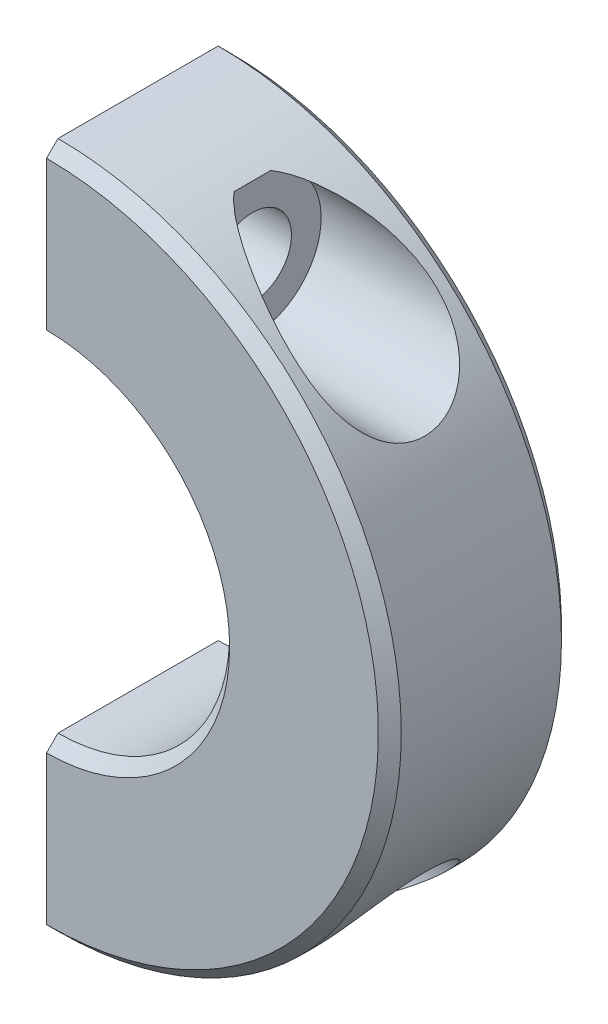
ISO-10303-21;
HEADER;
FILE_DESCRIPTION(('STEP AP214'),'2;1');
FILE_NAME('part.step','',(''),(''),'','','');
FILE_SCHEMA(('AUTOMOTIVE_DESIGN { 1 0 10303 214 1 1 1 1 }'));
ENDSEC;
DATA;
#1=APPLICATION_CONTEXT('core data for automotive mechanical design processes');
#2=APPLICATION_PROTOCOL_DEFINITION('international standard','automotive_design',2000,#1);
#3=PRODUCT_CONTEXT('',#1,'mechanical');
#4=PRODUCT('Part','Part','',(#3));
#5=PRODUCT_RELATED_PRODUCT_CATEGORY('part','',(#4));
#6=PRODUCT_DEFINITION_FORMATION('','',#4);
#7=PRODUCT_DEFINITION_CONTEXT('part definition',#1,'design');
#8=PRODUCT_DEFINITION('design','',#6,#7);
#9=PRODUCT_DEFINITION_SHAPE('','',#8);
#10=(LENGTH_UNIT() NAMED_UNIT(*) SI_UNIT(.MILLI.,.METRE.));
#11=(NAMED_UNIT(*) PLANE_ANGLE_UNIT() SI_UNIT($,.RADIAN.));
#12=(NAMED_UNIT(*) SI_UNIT($,.STERADIAN.) SOLID_ANGLE_UNIT());
#13=UNCERTAINTY_MEASURE_WITH_UNIT(LENGTH_MEASURE(1.E-05),#10,'distance_accuracy_value','');
#14=(GEOMETRIC_REPRESENTATION_CONTEXT(3) GLOBAL_UNCERTAINTY_ASSIGNED_CONTEXT((#13)) GLOBAL_UNIT_ASSIGNED_CONTEXT((#10,
#11,#12)) REPRESENTATION_CONTEXT('',''));
#15=CARTESIAN_POINT('',(0.,0.,0.));
#16=DIRECTION('',(0.,0.,1.));
#17=DIRECTION('',(1.,0.,0.));
#18=AXIS2_PLACEMENT_3D('',#15,#16,#17);
#19=CARTESIAN_POINT('',(-7.82432608787618,8.0052353615843,8.));
#20=DIRECTION('',(0.,0.,-1.));
#21=DIRECTION('',(-1.,0.,0.));
#22=AXIS2_PLACEMENT_3D('',#19,#20,#21);
#23=CYLINDRICAL_SURFACE('',#22,7.5);
#24=DIRECTION('',(0.,0.,-1.));
#25=VECTOR('',#24,1.);
#26=CARTESIAN_POINT('',(-7.82432608787618,15.5052353615843,8.));
#27=LINE('',#26,#25);
#28=CARTESIAN_POINT('',(-7.82432608787618,15.5052353615843,7.5));
#29=VERTEX_POINT('',#28);
#30=CARTESIAN_POINT('',(-7.82432608787618,15.5052353615843,0.5));
#31=VERTEX_POINT('',#30);
#32=EDGE_CURVE('E189',#29,#31,#27,.T.);
#33=ORIENTED_EDGE('',*,*,#32,.T.);
#34=CARTESIAN_POINT('',(-7.82432608787618,8.0052353615843,0.5));
#35=DIRECTION('',(0.,0.,1.));
#36=DIRECTION('',(1.,0.,0.));
#37=AXIS2_PLACEMENT_3D('',#34,#35,#36);
#38=CIRCLE('',#37,7.5);
#39=CARTESIAN_POINT('',(-7.82432608787618,0.505235361584304,0.5));
#40=VERTEX_POINT('',#39);
#41=EDGE_CURVE('E11',#31,#40,#38,.F.);
#42=ORIENTED_EDGE('',*,*,#41,.T.);
#43=DIRECTION('',(0.,0.,-1.));
#44=VECTOR('',#43,1.);
#45=CARTESIAN_POINT('',(-7.82432608787618,0.505235361584304,8.));
#46=LINE('',#45,#44);
#47=CARTESIAN_POINT('',(-7.82432608787618,0.505235361584304,7.5));
#48=VERTEX_POINT('',#47);
#49=EDGE_CURVE('E181',#48,#40,#46,.T.);
#50=ORIENTED_EDGE('',*,*,#49,.F.);
#51=CARTESIAN_POINT('',(-7.82432608787618,8.0052353615843,7.5));
#52=DIRECTION('',(0.,0.,1.));
#53=DIRECTION('',(1.,0.,0.));
#54=AXIS2_PLACEMENT_3D('',#51,#52,#53);
#55=CIRCLE('',#54,7.5);
#56=EDGE_CURVE('E48',#48,#29,#55,.T.);
#57=ORIENTED_EDGE('',*,*,#56,.T.);
#58=EDGE_LOOP('',(#33,#42,#50,#57));
#59=FACE_BOUND('',#58,.T.);
#60=ADVANCED_FACE('F39',(#59),#23,.F.);
#61=CARTESIAN_POINT('',(-7.82432608787618,0.505235361584304,8.));
#62=DIRECTION('',(1.,0.,0.));
#63=DIRECTION('',(0.,0.,-1.));
#64=AXIS2_PLACEMENT_3D('',#61,#62,#63);
#65=PLANE('',#64);
#66=CARTESIAN_POINT('',(-7.82432608787618,-3.2447646384157,4.));
#67=DIRECTION('',(-1.,0.,0.));
#68=DIRECTION('',(0.,0.,1.));
#69=AXIS2_PLACEMENT_3D('',#66,#67,#68);
#70=CIRCLE('',#69,1.7);
#71=CARTESIAN_POINT('',(-7.82432608787618,-3.2447646384157,5.7));
#72=VERTEX_POINT('',#71);
#73=EDGE_CURVE('E211',#72,#72,#70,.T.);
#74=ORIENTED_EDGE('',*,*,#73,.F.);
#75=EDGE_LOOP('',(#74));
#76=FACE_BOUND('',#75,.T.);
#77=DIRECTION('',(0.,-1.,0.));
#78=VECTOR('',#77,1.);
#79=CARTESIAN_POINT('',(-7.82432608787618,0.505235361584304,0.));
#80=LINE('',#79,#78);
#81=CARTESIAN_POINT('',(-7.82432608787618,0.00523536158430343,0.));
#82=VERTEX_POINT('',#81);
#83=CARTESIAN_POINT('',(-7.82432608787618,-6.49476463841569,0.));
#84=VERTEX_POINT('',#83);
#85=EDGE_CURVE('E197',#82,#84,#80,.T.);
#86=ORIENTED_EDGE('',*,*,#85,.T.);
#87=DIRECTION('',(0.,0.707106781186546,-0.707106781186549));
#88=VECTOR('',#87,1.);
#89=CARTESIAN_POINT('',(-7.82432608787618,8.0052353615843,-14.5));
#90=LINE('',#89,#88);
#91=CARTESIAN_POINT('',(-7.82432608787618,-6.9947646384157,0.500000000000006));
#92=VERTEX_POINT('',#91);
#93=EDGE_CURVE('E227',#84,#92,#90,.F.);
#94=ORIENTED_EDGE('',*,*,#93,.T.);
#95=DIRECTION('',(0.,0.,-1.));
#96=VECTOR('',#95,1.);
#97=CARTESIAN_POINT('',(-7.82432608787618,-6.9947646384157,8.));
#98=LINE('',#97,#96);
#99=CARTESIAN_POINT('',(-7.82432608787618,-6.9947646384157,7.5));
#100=VERTEX_POINT('',#99);
#101=EDGE_CURVE('E183',#100,#92,#98,.T.);
#102=ORIENTED_EDGE('',*,*,#101,.F.);
#103=DIRECTION('',(0.,-0.707106781186547,-0.707106781186548));
#104=VECTOR('',#103,1.);
#105=CARTESIAN_POINT('',(-7.82432608787618,8.0052353615843,22.5));
#106=LINE('',#105,#104);
#107=CARTESIAN_POINT('',(-7.82432608787618,-6.49476463841569,8.));
#108=VERTEX_POINT('',#107);
#109=EDGE_CURVE('E236',#100,#108,#106,.F.);
#110=ORIENTED_EDGE('',*,*,#109,.T.);
#111=DIRECTION('',(0.,-1.,0.));
#112=VECTOR('',#111,1.);
#113=CARTESIAN_POINT('',(-7.82432608787618,0.505235361584304,8.));
#114=LINE('',#113,#112);
#115=CARTESIAN_POINT('',(-7.82432608787618,0.0052353615843069,8.));
#116=VERTEX_POINT('',#115);
#117=EDGE_CURVE('E196',#116,#108,#114,.T.);
#118=ORIENTED_EDGE('',*,*,#117,.F.);
#119=DIRECTION('',(0.,0.707106781186548,-0.707106781186547));
#120=VECTOR('',#119,1.);
#121=CARTESIAN_POINT('',(-7.82432608787618,8.0052353615843,0.));
#122=LINE('',#121,#120);
#123=EDGE_CURVE('E62',#116,#48,#122,.T.);
#124=ORIENTED_EDGE('',*,*,#123,.T.);
#125=ORIENTED_EDGE('',*,*,#49,.T.);
#126=DIRECTION('',(0.,-0.707106781186548,-0.707106781186547));
#127=VECTOR('',#126,1.);
#128=CARTESIAN_POINT('',(-7.82432608787618,8.0052353615843,8.));
#129=LINE('',#128,#127);
#130=EDGE_CURVE('E55',#40,#82,#129,.T.);
#131=ORIENTED_EDGE('',*,*,#130,.T.);
#132=EDGE_LOOP('',(#86,#94,#102,#110,#118,#124,#125,#131));
#133=FACE_BOUND('',#132,.T.);
#134=ADVANCED_FACE('F222',(#76,#133),#65,.F.);
#135=CARTESIAN_POINT('',(-7.82432608787618,8.0052353615843,8.));
#136=DIRECTION('',(0.,0.,-1.));
#137=DIRECTION('',(-1.,0.,0.));
#138=AXIS2_PLACEMENT_3D('',#135,#136,#137);
#139=CYLINDRICAL_SURFACE('',#138,15.);
#140=DIRECTION('',(0.,0.,-1.));
#141=VECTOR('',#140,1.);
#142=CARTESIAN_POINT('',(-2.82432608787618,-6.13690026214665,8.));
#143=LINE('',#142,#141);
#144=CARTESIAN_POINT('',(-2.82432608787618,-6.13690026214665,3.20278513940947));
#145=VERTEX_POINT('',#144);
#146=CARTESIAN_POINT('',(-2.82432608787618,-6.13690026214665,4.79721486059054));
#147=VERTEX_POINT('',#146);
#148=EDGE_CURVE('E117',#145,#147,#143,.F.);
#149=ORIENTED_EDGE('',*,*,#148,.T.);
#150=CARTESIAN_POINT('',(-2.82432608787618,-6.13690026214665,4.79721486059054));
#151=CARTESIAN_POINT('',(-2.78529218232286,-6.1231043409359,4.84719100407327));
#152=CARTESIAN_POINT('',(-2.74437424641503,-6.10845163725558,4.89536280965611));
#153=CARTESIAN_POINT('',(-2.65966012991618,-6.07766974332576,4.9884732540032));
#154=CARTESIAN_POINT('',(-2.61586855247028,-6.06154289889324,5.03341683312629));
#155=CARTESIAN_POINT('',(-2.52638460330731,-6.02808565835705,5.12039100021975));
#156=CARTESIAN_POINT('',(-2.48070234615545,-6.01076140020956,5.16243451557917));
#157=CARTESIAN_POINT('',(-2.38771593453564,-5.97495613829153,5.24420517628907));
#158=CARTESIAN_POINT('',(-2.34041105483384,-5.95647461415061,5.28393126386192));
#159=CARTESIAN_POINT('',(-2.19726853041354,-5.89968084384567,5.39956546586842));
#160=CARTESIAN_POINT('',(-2.09962444749255,-5.8598044270215,5.4724735893768));
#161=CARTESIAN_POINT('',(-1.901256788298,-5.77623335003575,5.6119145546425));
#162=CARTESIAN_POINT('',(-1.80052830702002,-5.73253237833672,5.67843646319437));
#163=CARTESIAN_POINT('',(-1.60638600752188,-5.64567987262714,5.8001882015986));
#164=CARTESIAN_POINT('',(-1.51313302061116,-5.6028350635394,5.85589528077497));
#165=CARTESIAN_POINT('',(-1.32561389209858,-5.51428767744473,5.96318559449079));
#166=CARTESIAN_POINT('',(-1.23134761979383,-5.46858472801475,6.01476828960869));
#167=CARTESIAN_POINT('',(-0.947665663827515,-5.32728563995255,6.16376584906218));
#168=CARTESIAN_POINT('',(-0.757308954467999,-5.22747352997324,6.25546572982553));
#169=CARTESIAN_POINT('',(-0.375114603963123,-5.01618131661349,6.42497672140016));
#170=CARTESIAN_POINT('',(-0.183275259831398,-4.90463086711146,6.50269553690919));
#171=CARTESIAN_POINT('',(0.199145734609086,-4.67049455582736,6.64308879976207));
#172=CARTESIAN_POINT('',(0.389727715068429,-4.54791172559355,6.70576736271218));
#173=CARTESIAN_POINT('',(0.730052308691822,-4.31774665428779,6.80375215901927));
#174=CARTESIAN_POINT('',(0.880273352428712,-4.21213102040259,6.84202975985637));
#175=CARTESIAN_POINT('',(1.1783483094478,-3.99417866256421,6.90711496239047));
#176=CARTESIAN_POINT('',(1.32620215044407,-3.88184173386097,6.93392221446454));
#177=CARTESIAN_POINT('',(1.61813637188202,-3.65127897957718,6.9746239009225));
#178=CARTESIAN_POINT('',(1.76222970247759,-3.53307909226184,6.98857065087017));
#179=CARTESIAN_POINT('',(2.04622733529665,-3.29109274814703,7.00208994307614));
#180=CARTESIAN_POINT('',(2.18613330479595,-3.16730856541869,7.00166828468938));
#181=CARTESIAN_POINT('',(2.51286061888396,-2.86713176238789,6.98123889882514));
#182=CARTESIAN_POINT('',(2.6973922861843,-2.68856316787768,6.95387697750506));
#183=CARTESIAN_POINT('',(2.96369188838489,-2.41756866460869,6.8852076778196));
#184=CARTESIAN_POINT('',(3.05072661238276,-2.32669339514503,6.85770449292985));
#185=CARTESIAN_POINT('',(3.22074295342735,-2.14473674180147,6.7927181337788));
#186=CARTESIAN_POINT('',(3.30372553486217,-2.05365541241531,6.75523734796767));
#187=CARTESIAN_POINT('',(3.51010845317683,-1.8215777838475,6.64555763889731));
#188=CARTESIAN_POINT('',(3.63018700171689,-1.6811251640532,6.56566123100889));
#189=CARTESIAN_POINT('',(3.85583585768621,-1.40779706331916,6.37760406948192));
#190=CARTESIAN_POINT('',(3.9614264336424,-1.27491115218697,6.26948342922482));
#191=CARTESIAN_POINT('',(4.13827269327686,-1.04537201556519,6.04541254894212));
#192=CARTESIAN_POINT('',(4.21230806759008,-0.946427790314849,5.93405329410025));
#193=CARTESIAN_POINT('',(4.31290201542041,-0.809011287237517,5.75296156971212));
#194=CARTESIAN_POINT('',(4.34470243796092,-0.765021283960531,5.69022322885745));
#195=CARTESIAN_POINT('',(4.40460777633115,-0.681295532996571,5.56031643284508));
#196=CARTESIAN_POINT('',(4.43271426566627,-0.641557975243287,5.49314988240128));
#197=CARTESIAN_POINT('',(4.48520610229745,-0.566667930480293,5.35427614612794));
#198=CARTESIAN_POINT('',(4.5095656111965,-0.531547504008076,5.28254186919453));
#199=CARTESIAN_POINT('',(4.55414492935846,-0.466777408615062,5.13544792231699));
#200=CARTESIAN_POINT('',(4.57436670163205,-0.437125146169329,5.06008999254821));
#201=CARTESIAN_POINT('',(4.61052392694642,-0.383778162047917,4.90629746398605));
#202=CARTESIAN_POINT('',(4.62645987923576,-0.360082746489341,4.82786322476796));
#203=CARTESIAN_POINT('',(4.65391960000187,-0.319065481903753,4.66862335013541));
#204=CARTESIAN_POINT('',(4.66544388472475,-0.301742887148977,4.58781799337742));
#205=CARTESIAN_POINT('',(4.6912223504235,-0.26289676967762,4.3607582251934));
#206=CARTESIAN_POINT('',(4.70059826650653,-0.248629915868049,4.21260046455027));
#207=CARTESIAN_POINT('',(4.70478536820911,-0.242271719293024,3.91572099455359));
#208=CARTESIAN_POINT('',(4.69960200260816,-0.250172080494378,3.76699951697415));
#209=CARTESIAN_POINT('',(4.67543976864684,-0.286705765454994,3.48067603128848));
#210=CARTESIAN_POINT('',(4.65714135460061,-0.314316190092229,3.34288436983413));
#211=CARTESIAN_POINT('',(4.60793520939356,-0.387667135973238,3.07461385513785));
#212=CARTESIAN_POINT('',(4.57702752981512,-0.433407583050133,2.94413497198305));
#213=CARTESIAN_POINT('',(4.50230416595351,-0.542198795177146,2.69013723754638));
#214=CARTESIAN_POINT('',(4.45816233751061,-0.605683804939867,2.56690162531999));
#215=CARTESIAN_POINT('',(4.35832533804461,-0.746360614687451,2.3337033762947));
#216=CARTESIAN_POINT('',(4.30262701092237,-0.823556158211032,2.22374437836591));
#217=CARTESIAN_POINT('',(4.17500537803691,-0.996353957885637,2.00865490043887));
#218=CARTESIAN_POINT('',(4.10203897586505,-1.09301105382246,1.90499579591325));
#219=CARTESIAN_POINT('',(3.94529366906487,-1.29489596252987,1.71588387247778));
#220=CARTESIAN_POINT('',(3.86150850441338,-1.40012872430127,1.63044167083556));
#221=CARTESIAN_POINT('',(3.64407840148495,-1.66517455242052,1.44225222063922));
#222=CARTESIAN_POINT('',(3.50520309518682,-1.82786426964289,1.34957051712391));
#223=CARTESIAN_POINT('',(3.21219597709418,-2.15565791501109,1.19883072773373));
#224=CARTESIAN_POINT('',(3.05803227333118,-2.32076625033214,1.14084687196328));
#225=CARTESIAN_POINT('',(2.78741558908685,-2.59741453226467,1.06833717824088));
#226=CARTESIAN_POINT('',(2.67387615813358,-2.70987143184161,1.04594007144186));
#227=CARTESIAN_POINT('',(2.44225771033988,-2.93199398962835,1.01423956150819));
#228=CARTESIAN_POINT('',(2.32417698428248,-3.04165857055982,1.00494113889151));
#229=CARTESIAN_POINT('',(2.08427272626293,-3.25734546407892,0.99808461199175));
#230=CARTESIAN_POINT('',(1.96244611993309,-3.36336462495724,1.00053642167684));
#231=CARTESIAN_POINT('',(1.71585259694316,-3.57107627065355,1.01598184512354));
#232=CARTESIAN_POINT('',(1.59108571926033,-3.67276881277665,1.02897531921743));
#233=CARTESIAN_POINT('',(1.28678474795697,-3.91278532153917,1.0718298893363));
#234=CARTESIAN_POINT('',(1.10605466756808,-4.04875384103785,1.1064587636326));
#235=CARTESIAN_POINT('',(0.741259710818778,-4.3106575525724,1.19235356330686));
#236=CARTESIAN_POINT('',(0.55719320302485,-4.43658766422556,1.24362784708308));
#237=CARTESIAN_POINT('',(0.186534296898217,-4.67842447330755,1.36129662937424));
#238=CARTESIAN_POINT('',(-6.38813830519539E-05,-4.79430102262766,1.42773457442667));
#239=CARTESIAN_POINT('',(-0.373908407766652,-5.01545587497353,1.57465714413166));
#240=CARTESIAN_POINT('',(-0.561154477071237,-5.12073826229055,1.65513632260163));
#241=CARTESIAN_POINT('',(-0.872503647781923,-5.2873243434353,1.80095911894465));
#242=CARTESIAN_POINT('',(-0.996860991875705,-5.35159453118221,1.86241310287616));
#243=CARTESIAN_POINT('',(-1.2445469296085,-5.47533032566898,1.99186626096498));
#244=CARTESIAN_POINT('',(-1.36787569366211,-5.53479674306867,2.05986432651436));
#245=CARTESIAN_POINT('',(-1.61178134591978,-5.64841862165566,2.20258149250821));
#246=CARTESIAN_POINT('',(-1.73237127798184,-5.7026075897861,2.27725150408171));
#247=CARTESIAN_POINT('',(-1.97030229912616,-5.80588960647062,2.43489798110475));
#248=CARTESIAN_POINT('',(-2.08764434607982,-5.85498416947404,2.51787196348272));
#249=CARTESIAN_POINT('',(-2.25824378736318,-5.92395751192868,2.64933416376634));
#250=CARTESIAN_POINT('',(-2.31369519596254,-5.94597866410991,2.6938570120178));
#251=CARTESIAN_POINT('',(-2.42267462512185,-5.98853395206053,2.78579450864694));
#252=CARTESIAN_POINT('',(-2.47620407997067,-6.00906920883346,2.83320692622923));
#253=CARTESIAN_POINT('',(-2.5810807995866,-6.04864381133971,2.93176955341941));
#254=CARTESIAN_POINT('',(-2.63241085283076,-6.06767209791053,2.98294287851893));
#255=CARTESIAN_POINT('',(-2.73143366499599,-6.1038147358403,3.0895307006927));
#256=CARTESIAN_POINT('',(-2.77911796280977,-6.12092467555294,3.14495449931267));
#257=CARTESIAN_POINT('',(-2.8243260878762,-6.13690026214666,3.20278513940943));
#258=B_SPLINE_CURVE_WITH_KNOTS('',3,(#150,#151,#152,#153,#154,#155,#156,#157,#158,#159,#160,
#161,#162,#163,#164,#165,#166,#167,#168,#169,#170,#171,#172,#173,#174,#175,#176,#177,#178,#179,
#180,#181,#182,#183,#184,#185,#186,#187,#188,#189,#190,#191,#192,#193,#194,#195,#196,#197,#198,
#199,#200,#201,#202,#203,#204,#205,#206,#207,#208,#209,#210,#211,#212,#213,#214,#215,#216,#217,
#218,#219,#220,#221,#222,#223,#224,#225,#226,#227,#228,#229,#230,#231,#232,#233,#234,#235,#236,
#237,#238,#239,#240,#241,#242,#243,#244,#245,#246,#247,#248,#249,#250,#251,#252,#253,#254,#255,
#256,#257),.UNSPECIFIED.,.F.,.F.,(4,2,2,2,2,2,2,2,2,2,2,2,2,2,2,2,2,2,2,2,2,2,2,2,2,2,2,2,2,2,2,
2,2,2,2,2,2,2,2,2,2,2,2,2,2,2,2,2,2,2,2,2,2,4),(0.,0.194525322173448,0.388746310896801,
0.582036562383876,0.775414360752055,1.15970972918033,1.54465169808248,1.89483353878806,
2.24506110455067,2.94529899983272,3.65000219764275,4.35451234040034,4.91681645578196,
5.47913770930068,6.03916125844485,6.59895877442071,7.37067667844941,7.7567040830323,
8.14263916287527,8.74420010561327,9.34491069767869,9.84169142903171,10.0903120190087,
10.3388263583828,10.5889842043371,10.8390230946937,11.0890328457776,11.3390133321818,
11.783916437783,12.2286530615518,12.6518454694284,13.0750361461137,13.5096589857879,
13.9444006782916,14.4207845702664,14.8974453562904,15.5929520154322,16.289941321464,
16.7734335498431,17.2571095670918,17.7411937458382,18.2252715110019,18.9106813756812,
19.5964359488021,20.284180557916,20.9716590017084,21.4301084916556,21.8884804536742,
22.3437210061299,22.7988258359913,23.0220853944685,23.2451747241755,23.4697731932897,
23.6948780154941),.UNSPECIFIED.);
#259=EDGE_CURVE('E124',#147,#145,#258,.T.);
#260=ORIENTED_EDGE('',*,*,#259,.T.);
#261=EDGE_LOOP('',(#149,#260));
#262=FACE_BOUND('',#261,.T.);
#263=DIRECTION('',(0.,0.,-1.));
#264=VECTOR('',#263,1.);
#265=CARTESIAN_POINT('',(-2.82432608787618,22.1473709853153,8.));
#266=LINE('',#265,#264);
#267=CARTESIAN_POINT('',(-2.82432608787618,22.1473709853153,4.79721486059054));
#268=VERTEX_POINT('',#267);
#269=CARTESIAN_POINT('',(-2.82432608787618,22.1473709853153,3.20278513940946));
#270=VERTEX_POINT('',#269);
#271=EDGE_CURVE('E178',#268,#270,#266,.T.);
#272=ORIENTED_EDGE('',*,*,#271,.T.);
#273=CARTESIAN_POINT('',(-2.82432608787618,22.1473709853153,3.20278513940946));
#274=CARTESIAN_POINT('',(-2.78529218232286,22.1335750641045,3.15280899592672));
#275=CARTESIAN_POINT('',(-2.74437424641503,22.1189223604242,3.10463719034389));
#276=CARTESIAN_POINT('',(-2.65966012991617,22.0881404664944,3.0115267459968));
#277=CARTESIAN_POINT('',(-2.61586855247028,22.0720136220618,2.96658316687371));
#278=CARTESIAN_POINT('',(-2.5263846033073,22.0385563815257,2.87960899978025));
#279=CARTESIAN_POINT('',(-2.48070234615545,22.0212321233782,2.83756548442083));
#280=CARTESIAN_POINT('',(-2.38771593453564,21.9854268614601,2.75579482371093));
#281=CARTESIAN_POINT('',(-2.34041105483384,21.9669453373192,2.71606873613808));
#282=CARTESIAN_POINT('',(-2.19726853041354,21.9101515670143,2.60043453413158));
#283=CARTESIAN_POINT('',(-2.09962444749255,21.8702751501901,2.5275264106232));
#284=CARTESIAN_POINT('',(-1.901256788298,21.7867040732044,2.3880854453575));
#285=CARTESIAN_POINT('',(-1.80052830702002,21.7430031015053,2.32156353680563));
#286=CARTESIAN_POINT('',(-1.60638600752187,21.6561505957957,2.1998117984014));
#287=CARTESIAN_POINT('',(-1.51313302061115,21.613305786708,2.14410471922503));
#288=CARTESIAN_POINT('',(-1.32561389209858,21.5247584006133,2.03681440550921));
#289=CARTESIAN_POINT('',(-1.23134761979383,21.4790554511833,1.98523171039131));
#290=CARTESIAN_POINT('',(-0.947665663827513,21.3377563631212,1.83623415093781));
#291=CARTESIAN_POINT('',(-0.757308954467998,21.2379442531418,1.74453427017446));
#292=CARTESIAN_POINT('',(-0.37511460396312,21.0266520397821,1.57502327859984));
#293=CARTESIAN_POINT('',(-0.183275259831394,20.9151015902801,1.49730446309081));
#294=CARTESIAN_POINT('',(0.199145734609092,20.680965278996,1.35691120023794));
#295=CARTESIAN_POINT('',(0.389727715068434,20.5583824487622,1.29423263728782));
#296=CARTESIAN_POINT('',(0.730052308691827,20.3282173774564,1.19624784098073));
#297=CARTESIAN_POINT('',(0.880273352428719,20.2226017435712,1.15797024014363));
#298=CARTESIAN_POINT('',(1.1783483094478,20.0046493857328,1.09288503760953));
#299=CARTESIAN_POINT('',(1.32620215044407,19.8923124570296,1.06607778553546));
#300=CARTESIAN_POINT('',(1.61813637188202,19.6617497027458,1.0253760990775));
#301=CARTESIAN_POINT('',(1.7622297024776,19.5435498154304,1.01142934912983));
#302=CARTESIAN_POINT('',(2.04622733529666,19.3015634713156,0.997910056923862));
#303=CARTESIAN_POINT('',(2.18613330479595,19.1777792885873,0.998331715310623));
#304=CARTESIAN_POINT('',(2.51286061888396,18.8776024855565,1.01876110117486));
#305=CARTESIAN_POINT('',(2.69739228618431,18.6990338910463,1.04612302249494));
#306=CARTESIAN_POINT('',(2.96369188838489,18.4280393877773,1.1147923221804));
#307=CARTESIAN_POINT('',(3.05072661238276,18.3371641183136,1.14229550707016));
#308=CARTESIAN_POINT('',(3.22074295342735,18.1552074649701,1.20728186622121));
#309=CARTESIAN_POINT('',(3.30372553486217,18.0641261355839,1.24476265203233));
#310=CARTESIAN_POINT('',(3.51010845317684,17.8320485070161,1.3544423611027));
#311=CARTESIAN_POINT('',(3.63018700171689,17.6915958872218,1.43433876899111));
#312=CARTESIAN_POINT('',(3.85583585768621,17.4182677864878,1.62239593051808));
#313=CARTESIAN_POINT('',(3.96142643364241,17.2853818753556,1.73051657077518));
#314=CARTESIAN_POINT('',(4.13827269327686,17.0558427387338,1.95458745105789));
#315=CARTESIAN_POINT('',(4.21230806759008,16.9568985134835,2.06594670589976));
#316=CARTESIAN_POINT('',(4.31290201542041,16.8194820104061,2.24703843028788));
#317=CARTESIAN_POINT('',(4.34470243796093,16.7754920071291,2.30977677114255));
#318=CARTESIAN_POINT('',(4.40460777633115,16.6917662561652,2.43968356715493));
#319=CARTESIAN_POINT('',(4.43271426566627,16.6520286984119,2.50685011759873));
#320=CARTESIAN_POINT('',(4.48520610229745,16.5771386536489,2.64572385387206));
#321=CARTESIAN_POINT('',(4.5095656111965,16.5420182271767,2.71745813080548));
#322=CARTESIAN_POINT('',(4.55414492935846,16.4772481317837,2.86455207768301));
#323=CARTESIAN_POINT('',(4.57436670163205,16.4475958693379,2.9399100074518));
#324=CARTESIAN_POINT('',(4.61052392694642,16.3942488852165,3.09370253601395));
#325=CARTESIAN_POINT('',(4.62645987923576,16.3705534696579,3.17213677523205));
#326=CARTESIAN_POINT('',(4.65391960000188,16.3295362050724,3.33137664986459));
#327=CARTESIAN_POINT('',(4.66544388472475,16.3122136103176,3.41218200662259));
#328=CARTESIAN_POINT('',(4.6912223504235,16.2733674928462,3.63924177480661));
#329=CARTESIAN_POINT('',(4.70059826650653,16.2591006390367,3.78739953544974));
#330=CARTESIAN_POINT('',(4.70478536820911,16.2527424424616,4.08427900544642));
#331=CARTESIAN_POINT('',(4.69960200260816,16.260642803663,4.23300048302586));
#332=CARTESIAN_POINT('',(4.67543976864684,16.2971764886236,4.51932396871153));
#333=CARTESIAN_POINT('',(4.6571413546006,16.3247869132608,4.65711563016587));
#334=CARTESIAN_POINT('',(4.60793520939356,16.3981378591418,4.92538614486215));
#335=CARTESIAN_POINT('',(4.57702752981512,16.4438783062187,5.05586502801695));
#336=CARTESIAN_POINT('',(4.50230416595351,16.5526695183458,5.30986276245362));
#337=CARTESIAN_POINT('',(4.45816233751061,16.6161545281085,5.43309837468002));
#338=CARTESIAN_POINT('',(4.3583253380446,16.7568313378561,5.6662966237053));
#339=CARTESIAN_POINT('',(4.30262701092237,16.8340268813796,5.7762556216341));
#340=CARTESIAN_POINT('',(4.17500537803691,17.0068246810542,5.99134509956114));
#341=CARTESIAN_POINT('',(4.10203897586505,17.1034817769911,6.09500420408675));
#342=CARTESIAN_POINT('',(3.94529366906487,17.3053666856985,6.28411612752222));
#343=CARTESIAN_POINT('',(3.86150850441338,17.4105994474699,6.36955832916444));
#344=CARTESIAN_POINT('',(3.64407840148495,17.6756452755891,6.55774777936078));
#345=CARTESIAN_POINT('',(3.50520309518682,17.8383349928115,6.65042948287609));
#346=CARTESIAN_POINT('',(3.21219597709417,18.1661286381797,6.80116927226627));
#347=CARTESIAN_POINT('',(3.05803227333117,18.3312369735008,6.85915312803672));
#348=CARTESIAN_POINT('',(2.78741558908684,18.6078852554333,6.93166282175912));
#349=CARTESIAN_POINT('',(2.67387615813357,18.7203421550102,6.95405992855814));
#350=CARTESIAN_POINT('',(2.44225771033988,18.942464712797,6.98576043849181));
#351=CARTESIAN_POINT('',(2.32417698428248,19.0521292937284,6.99505886110849));
#352=CARTESIAN_POINT('',(2.08427272626292,19.2678161872475,7.00191538800825));
#353=CARTESIAN_POINT('',(1.96244611993308,19.3738353481258,6.99946357832316));
#354=CARTESIAN_POINT('',(1.71585259694315,19.5815469938222,6.98401815487646));
#355=CARTESIAN_POINT('',(1.59108571926032,19.6832395359453,6.97102468078257));
#356=CARTESIAN_POINT('',(1.28678474795696,19.9232560447078,6.9281701106637));
#357=CARTESIAN_POINT('',(1.10605466756807,20.0592245642065,6.8935412363674));
#358=CARTESIAN_POINT('',(0.741259710818766,20.321128275741,6.80764643669314));
#359=CARTESIAN_POINT('',(0.557193203024839,20.4470583873942,6.75637215291692));
#360=CARTESIAN_POINT('',(0.186534296898206,20.6888951964762,6.63870337062576));
#361=CARTESIAN_POINT('',(-6.38813830626062E-05,20.8047717457963,6.57226542557332));
#362=CARTESIAN_POINT('',(-0.373908407766662,21.0259265981421,6.42534285586834));
#363=CARTESIAN_POINT('',(-0.561154477071247,21.1312089854592,6.34486367739837));
#364=CARTESIAN_POINT('',(-0.872503647781934,21.2977950666039,6.19904088105535));
#365=CARTESIAN_POINT('',(-0.996860991875717,21.3620652543508,6.13758689712384));
#366=CARTESIAN_POINT('',(-1.24454692960851,21.4858010488376,6.00813373903501));
#367=CARTESIAN_POINT('',(-1.36787569366212,21.5452674662373,5.94013567348563));
#368=CARTESIAN_POINT('',(-1.61178134591979,21.6588893448243,5.79741850749178));
#369=CARTESIAN_POINT('',(-1.73237127798186,21.7130783129547,5.72274849591829));
#370=CARTESIAN_POINT('',(-1.97030229912617,21.8163603296392,5.56510201889524));
#371=CARTESIAN_POINT('',(-2.08764434607983,21.8654548926426,5.48212803651727));
#372=CARTESIAN_POINT('',(-2.25824378736319,21.9344282350973,5.35066583623365));
#373=CARTESIAN_POINT('',(-2.31369519596256,21.9564493872785,5.30614298798219));
#374=CARTESIAN_POINT('',(-2.42267462512186,21.9990046752291,5.21420549135305));
#375=CARTESIAN_POINT('',(-2.47620407997067,22.0195399320021,5.16679307377076));
#376=CARTESIAN_POINT('',(-2.5810807995866,22.0591145345083,5.06823044658058));
#377=CARTESIAN_POINT('',(-2.63241085283076,22.0781428210791,5.01705712148107));
#378=CARTESIAN_POINT('',(-2.73143366499599,22.1142854590089,4.9104692993073));
#379=CARTESIAN_POINT('',(-2.77911796280977,22.1313953987216,4.85504550068733));
#380=CARTESIAN_POINT('',(-2.8243260878762,22.1473709853153,4.79721486059057));
#381=B_SPLINE_CURVE_WITH_KNOTS('',3,(#273,#274,#275,#276,#277,#278,#279,#280,#281,#282,#283,
#284,#285,#286,#287,#288,#289,#290,#291,#292,#293,#294,#295,#296,#297,#298,#299,#300,#301,#302,
#303,#304,#305,#306,#307,#308,#309,#310,#311,#312,#313,#314,#315,#316,#317,#318,#319,#320,#321,
#322,#323,#324,#325,#326,#327,#328,#329,#330,#331,#332,#333,#334,#335,#336,#337,#338,#339,#340,
#341,#342,#343,#344,#345,#346,#347,#348,#349,#350,#351,#352,#353,#354,#355,#356,#357,#358,#359,
#360,#361,#362,#363,#364,#365,#366,#367,#368,#369,#370,#371,#372,#373,#374,#375,#376,#377,#378,
#379,#380),.UNSPECIFIED.,.F.,.F.,(4,2,2,2,2,2,2,2,2,2,2,2,2,2,2,2,2,2,2,2,2,2,2,2,2,2,2,2,2,2,2,
2,2,2,2,2,2,2,2,2,2,2,2,2,2,2,2,2,2,2,2,2,2,4),(0.,0.194525322173449,0.388746310896801,
0.582036562383878,0.775414360752055,1.15970972918032,1.54465169808248,1.89483353878806,
2.24506110455067,2.94529899983272,3.65000219764275,4.35451234040034,4.91681645578196,
5.47913770930068,6.03916125844485,6.59895877442071,7.37067667844941,7.7567040830323,
8.14263916287528,8.74420010561327,9.3449106976787,9.84169142903172,10.0903120190087,
10.3388263583828,10.5889842043371,10.8390230946937,11.0890328457776,11.3390133321818,
11.783916437783,12.2286530615518,12.6518454694284,13.0750361461137,13.5096589857879,
13.9444006782916,14.4207845702664,14.8974453562904,15.5929520154322,16.289941321464,
16.7734335498431,17.2571095670918,17.7411937458382,18.2252715110019,18.9106813756812,
19.5964359488021,20.284180557916,20.9716590017084,21.4301084916556,21.8884804536742,
22.34372100613,22.7988258359913,23.0220853944685,23.2451747241755,23.4697731932897,
23.6948780154941),.UNSPECIFIED.);
#382=EDGE_CURVE('E125',#270,#268,#381,.T.);
#383=ORIENTED_EDGE('',*,*,#382,.T.);
#384=EDGE_LOOP('',(#272,#383));
#385=FACE_BOUND('',#384,.T.);
#386=ORIENTED_EDGE('',*,*,#101,.T.);
#387=CARTESIAN_POINT('',(-7.82432608787618,8.0052353615843,0.500000000000006));
#388=DIRECTION('',(0.,0.,1.));
#389=DIRECTION('',(1.,0.,0.));
#390=AXIS2_PLACEMENT_3D('',#387,#388,#389);
#391=CIRCLE('',#390,15.);
#392=CARTESIAN_POINT('',(-7.82432608787618,23.0052353615843,0.500000000000006));
#393=VERTEX_POINT('',#392);
#394=EDGE_CURVE('E135',#92,#393,#391,.T.);
#395=ORIENTED_EDGE('',*,*,#394,.T.);
#396=DIRECTION('',(0.,0.,-1.));
#397=VECTOR('',#396,1.);
#398=CARTESIAN_POINT('',(-7.82432608787618,23.0052353615843,8.));
#399=LINE('',#398,#397);
#400=CARTESIAN_POINT('',(-7.82432608787618,23.0052353615843,7.5));
#401=VERTEX_POINT('',#400);
#402=EDGE_CURVE('E186',#401,#393,#399,.T.);
#403=ORIENTED_EDGE('',*,*,#402,.F.);
#404=CARTESIAN_POINT('',(-7.82432608787618,8.0052353615843,7.5));
#405=DIRECTION('',(0.,0.,1.));
#406=DIRECTION('',(1.,0.,0.));
#407=AXIS2_PLACEMENT_3D('',#404,#405,#406);
#408=CIRCLE('',#407,15.);
#409=EDGE_CURVE('E133',#401,#100,#408,.F.);
#410=ORIENTED_EDGE('',*,*,#409,.T.);
#411=EDGE_LOOP('',(#386,#395,#403,#410));
#412=FACE_BOUND('',#411,.T.);
#413=ADVANCED_FACE('F131',(#262,#385,#412),#139,.T.);
#414=CARTESIAN_POINT('',(-7.82432608787618,23.0052353615843,8.));
#415=DIRECTION('',(1.,0.,0.));
#416=DIRECTION('',(0.,0.,-1.));
#417=AXIS2_PLACEMENT_3D('',#414,#415,#416);
#418=PLANE('',#417);
#419=CARTESIAN_POINT('',(-7.82432608787618,19.2552353615843,4.));
#420=DIRECTION('',(-1.,0.,0.));
#421=DIRECTION('',(0.,0.,1.));
#422=AXIS2_PLACEMENT_3D('',#419,#420,#421);
#423=CIRCLE('',#422,1.7);
#424=CARTESIAN_POINT('',(-7.82432608787618,19.2552353615843,5.7));
#425=VERTEX_POINT('',#424);
#426=EDGE_CURVE('E208',#425,#425,#423,.T.);
#427=ORIENTED_EDGE('',*,*,#426,.F.);
#428=EDGE_LOOP('',(#427));
#429=FACE_BOUND('',#428,.T.);
#430=ORIENTED_EDGE('',*,*,#402,.T.);
#431=DIRECTION('',(0.,0.707106781186546,0.707106781186549));
#432=VECTOR('',#431,1.);
#433=CARTESIAN_POINT('',(-7.82432608787618,8.0052353615843,-14.5));
#434=LINE('',#433,#432);
#435=CARTESIAN_POINT('',(-7.82432608787618,22.5052353615843,0.));
#436=VERTEX_POINT('',#435);
#437=EDGE_CURVE('E262',#393,#436,#434,.F.);
#438=ORIENTED_EDGE('',*,*,#437,.T.);
#439=DIRECTION('',(0.,-1.,0.));
#440=VECTOR('',#439,1.);
#441=CARTESIAN_POINT('',(-7.82432608787618,23.0052353615843,0.));
#442=LINE('',#441,#440);
#443=CARTESIAN_POINT('',(-7.82432608787618,16.0052353615843,0.));
#444=VERTEX_POINT('',#443);
#445=EDGE_CURVE('E193',#436,#444,#442,.T.);
#446=ORIENTED_EDGE('',*,*,#445,.T.);
#447=DIRECTION('',(0.,-0.707106781186548,0.707106781186547));
#448=VECTOR('',#447,1.);
#449=CARTESIAN_POINT('',(-7.82432608787618,8.0052353615843,8.));
#450=LINE('',#449,#448);
#451=EDGE_CURVE('E255',#444,#31,#450,.T.);
#452=ORIENTED_EDGE('',*,*,#451,.T.);
#453=ORIENTED_EDGE('',*,*,#32,.F.);
#454=DIRECTION('',(0.,0.707106781186548,0.707106781186547));
#455=VECTOR('',#454,1.);
#456=CARTESIAN_POINT('',(-7.82432608787618,8.0052353615843,0.));
#457=LINE('',#456,#455);
#458=CARTESIAN_POINT('',(-7.82432608787618,16.0052353615843,8.));
#459=VERTEX_POINT('',#458);
#460=EDGE_CURVE('E253',#29,#459,#457,.T.);
#461=ORIENTED_EDGE('',*,*,#460,.T.);
#462=DIRECTION('',(0.,-1.,0.));
#463=VECTOR('',#462,1.);
#464=CARTESIAN_POINT('',(-7.82432608787618,23.0052353615843,8.));
#465=LINE('',#464,#463);
#466=CARTESIAN_POINT('',(-7.82432608787618,22.5052353615843,8.));
#467=VERTEX_POINT('',#466);
#468=EDGE_CURVE('E192',#467,#459,#465,.T.);
#469=ORIENTED_EDGE('',*,*,#468,.F.);
#470=DIRECTION('',(0.,-0.707106781186547,0.707106781186548));
#471=VECTOR('',#470,1.);
#472=CARTESIAN_POINT('',(-7.82432608787618,8.0052353615843,22.5));
#473=LINE('',#472,#471);
#474=EDGE_CURVE('E258',#467,#401,#473,.F.);
#475=ORIENTED_EDGE('',*,*,#474,.T.);
#476=EDGE_LOOP('',(#430,#438,#446,#452,#453,#461,#469,#475));
#477=FACE_BOUND('',#476,.T.);
#478=ADVANCED_FACE('F251',(#429,#477),#418,.F.);
#479=CARTESIAN_POINT('',(-7.82432608787618,8.0052353615843,8.));
#480=DIRECTION('',(0.,0.,1.));
#481=DIRECTION('',(1.,0.,0.));
#482=AXIS2_PLACEMENT_3D('',#479,#480,#481);
#483=PLANE('',#482);
#484=ORIENTED_EDGE('',*,*,#117,.T.);
#485=CARTESIAN_POINT('',(-7.82432608787618,8.0052353615843,8.));
#486=DIRECTION('',(0.,0.,1.));
#487=DIRECTION('',(1.,0.,0.));
#488=AXIS2_PLACEMENT_3D('',#485,#486,#487);
#489=CIRCLE('',#488,14.5);
#490=EDGE_CURVE('E239',#108,#467,#489,.T.);
#491=ORIENTED_EDGE('',*,*,#490,.T.);
#492=ORIENTED_EDGE('',*,*,#468,.T.);
#493=CARTESIAN_POINT('',(-7.82432608787618,8.0052353615843,8.));
#494=DIRECTION('',(0.,0.,1.));
#495=DIRECTION('',(1.,0.,0.));
#496=AXIS2_PLACEMENT_3D('',#493,#494,#495);
#497=CIRCLE('',#496,8.);
#498=EDGE_CURVE('E235',#459,#116,#497,.F.);
#499=ORIENTED_EDGE('',*,*,#498,.T.);
#500=EDGE_LOOP('',(#484,#491,#492,#499));
#501=FACE_BOUND('',#500,.T.);
#502=ADVANCED_FACE('F170',(#501),#483,.T.);
#503=CARTESIAN_POINT('',(-7.82432608787618,8.0052353615843,0.));
#504=DIRECTION('',(0.,0.,1.));
#505=DIRECTION('',(1.,0.,0.));
#506=AXIS2_PLACEMENT_3D('',#503,#504,#505);
#507=PLANE('',#506);
#508=ORIENTED_EDGE('',*,*,#445,.F.);
#509=CARTESIAN_POINT('',(-7.82432608787618,8.0052353615843,0.));
#510=DIRECTION('',(0.,0.,1.));
#511=DIRECTION('',(1.,0.,0.));
#512=AXIS2_PLACEMENT_3D('',#509,#510,#511);
#513=CIRCLE('',#512,14.5);
#514=EDGE_CURVE('E233',#436,#84,#513,.F.);
#515=ORIENTED_EDGE('',*,*,#514,.T.);
#516=ORIENTED_EDGE('',*,*,#85,.F.);
#517=CARTESIAN_POINT('',(-7.82432608787618,8.0052353615843,0.));
#518=DIRECTION('',(0.,0.,1.));
#519=DIRECTION('',(1.,0.,0.));
#520=AXIS2_PLACEMENT_3D('',#517,#518,#519);
#521=CIRCLE('',#520,8.);
#522=EDGE_CURVE('E264',#82,#444,#521,.T.);
#523=ORIENTED_EDGE('',*,*,#522,.T.);
#524=EDGE_LOOP('',(#508,#515,#516,#523));
#525=FACE_BOUND('',#524,.T.);
#526=ADVANCED_FACE('F168',(#525),#507,.F.);
#527=CARTESIAN_POINT('',(7.17567391212382,19.2552353615843,4.));
#528=DIRECTION('',(-1.,0.,0.));
#529=DIRECTION('',(0.,0.,1.));
#530=AXIS2_PLACEMENT_3D('',#527,#528,#529);
#531=CYLINDRICAL_SURFACE('',#530,3.);
#532=CARTESIAN_POINT('',(-2.82432608787618,19.2552353615843,4.));
#533=DIRECTION('',(-1.,0.,0.));
#534=DIRECTION('',(0.,0.,1.));
#535=AXIS2_PLACEMENT_3D('',#532,#533,#534);
#536=CIRCLE('',#535,3.);
#537=EDGE_CURVE('E200',#270,#268,#536,.T.);
#538=ORIENTED_EDGE('',*,*,#537,.T.);
#539=ORIENTED_EDGE('',*,*,#382,.F.);
#540=EDGE_LOOP('',(#538,#539));
#541=FACE_BOUND('',#540,.T.);
#542=ADVANCED_FACE('F163',(#541),#531,.F.);
#543=CARTESIAN_POINT('',(-2.82432608787618,19.2552353615843,4.));
#544=DIRECTION('',(-1.,0.,0.));
#545=DIRECTION('',(0.,0.,1.));
#546=AXIS2_PLACEMENT_3D('',#543,#544,#545);
#547=PLANE('',#546);
#548=CARTESIAN_POINT('',(-2.82432608787618,19.2552353615843,4.));
#549=DIRECTION('',(-1.,0.,0.));
#550=DIRECTION('',(0.,0.,1.));
#551=AXIS2_PLACEMENT_3D('',#548,#549,#550);
#552=CIRCLE('',#551,1.7);
#553=CARTESIAN_POINT('',(-2.82432608787618,19.2552353615843,5.7));
#554=VERTEX_POINT('',#553);
#555=EDGE_CURVE('E207',#554,#554,#552,.T.);
#556=ORIENTED_EDGE('',*,*,#555,.T.);
#557=EDGE_LOOP('',(#556));
#558=FACE_BOUND('',#557,.T.);
#559=ORIENTED_EDGE('',*,*,#537,.F.);
#560=ORIENTED_EDGE('',*,*,#271,.F.);
#561=EDGE_LOOP('',(#559,#560));
#562=FACE_BOUND('',#561,.T.);
#563=ADVANCED_FACE('F159',(#558,#562),#547,.F.);
#564=CARTESIAN_POINT('',(-2.82432608787618,19.2552353615843,4.));
#565=DIRECTION('',(-1.,0.,0.));
#566=DIRECTION('',(0.,0.,1.));
#567=AXIS2_PLACEMENT_3D('',#564,#565,#566);
#568=CYLINDRICAL_SURFACE('',#567,1.7);
#569=ORIENTED_EDGE('',*,*,#555,.F.);
#570=EDGE_LOOP('',(#569));
#571=FACE_BOUND('',#570,.T.);
#572=ORIENTED_EDGE('',*,*,#426,.T.);
#573=EDGE_LOOP('',(#572));
#574=FACE_BOUND('',#573,.T.);
#575=ADVANCED_FACE('F155',(#571,#574),#568,.F.);
#576=CARTESIAN_POINT('',(-2.82432608787618,-3.2447646384157,4.));
#577=DIRECTION('',(-1.,0.,0.));
#578=DIRECTION('',(0.,0.,1.));
#579=AXIS2_PLACEMENT_3D('',#576,#577,#578);
#580=CYLINDRICAL_SURFACE('',#579,1.7);
#581=CARTESIAN_POINT('',(-2.82432608787618,-3.2447646384157,4.));
#582=DIRECTION('',(-1.,0.,0.));
#583=DIRECTION('',(0.,0.,1.));
#584=AXIS2_PLACEMENT_3D('',#581,#582,#583);
#585=CIRCLE('',#584,1.7);
#586=CARTESIAN_POINT('',(-2.82432608787618,-3.2447646384157,5.7));
#587=VERTEX_POINT('',#586);
#588=EDGE_CURVE('E129',#587,#587,#585,.T.);
#589=ORIENTED_EDGE('',*,*,#588,.F.);
#590=EDGE_LOOP('',(#589));
#591=FACE_BOUND('',#590,.T.);
#592=ORIENTED_EDGE('',*,*,#73,.T.);
#593=EDGE_LOOP('',(#592));
#594=FACE_BOUND('',#593,.T.);
#595=ADVANCED_FACE('F152',(#591,#594),#580,.F.);
#596=CARTESIAN_POINT('',(7.17567391212382,-3.2447646384157,4.));
#597=DIRECTION('',(-1.,0.,0.));
#598=DIRECTION('',(0.,0.,1.));
#599=AXIS2_PLACEMENT_3D('',#596,#597,#598);
#600=CYLINDRICAL_SURFACE('',#599,3.);
#601=CARTESIAN_POINT('',(-2.82432608787618,-3.2447646384157,4.));
#602=DIRECTION('',(-1.,0.,0.));
#603=DIRECTION('',(0.,0.,1.));
#604=AXIS2_PLACEMENT_3D('',#601,#602,#603);
#605=CIRCLE('',#604,3.);
#606=EDGE_CURVE('E120',#147,#145,#605,.T.);
#607=ORIENTED_EDGE('',*,*,#606,.T.);
#608=ORIENTED_EDGE('',*,*,#259,.F.);
#609=EDGE_LOOP('',(#607,#608));
#610=FACE_BOUND('',#609,.T.);
#611=ADVANCED_FACE('F128',(#610),#600,.F.);
#612=CARTESIAN_POINT('',(-2.82432608787618,-3.2447646384157,4.));
#613=DIRECTION('',(-1.,0.,0.));
#614=DIRECTION('',(0.,0.,1.));
#615=AXIS2_PLACEMENT_3D('',#612,#613,#614);
#616=PLANE('',#615);
#617=ORIENTED_EDGE('',*,*,#588,.T.);
#618=EDGE_LOOP('',(#617));
#619=FACE_BOUND('',#618,.T.);
#620=ORIENTED_EDGE('',*,*,#606,.F.);
#621=ORIENTED_EDGE('',*,*,#148,.F.);
#622=EDGE_LOOP('',(#620,#621));
#623=FACE_BOUND('',#622,.T.);
#624=ADVANCED_FACE('F119',(#619,#623),#616,.F.);
#625=CARTESIAN_POINT('',(-7.82432608787618,8.0052353615843,0.500000000000006));
#626=DIRECTION('',(0.,0.,1.));
#627=DIRECTION('',(1.,0.,0.));
#628=AXIS2_PLACEMENT_3D('',#625,#626,#627);
#629=CONICAL_SURFACE('',#628,15.,0.785398163397447);
#630=ORIENTED_EDGE('',*,*,#93,.F.);
#631=ORIENTED_EDGE('',*,*,#514,.F.);
#632=ORIENTED_EDGE('',*,*,#437,.F.);
#633=ORIENTED_EDGE('',*,*,#394,.F.);
#634=EDGE_LOOP('',(#630,#631,#632,#633));
#635=FACE_BOUND('',#634,.T.);
#636=ADVANCED_FACE('F232',(#635),#629,.T.);
#637=CARTESIAN_POINT('',(-7.82432608787618,8.0052353615843,8.));
#638=DIRECTION('',(0.,0.,-1.));
#639=DIRECTION('',(-1.,0.,0.));
#640=AXIS2_PLACEMENT_3D('',#637,#638,#639);
#641=CONICAL_SURFACE('',#640,14.5,0.785398163397448);
#642=ORIENTED_EDGE('',*,*,#109,.F.);
#643=ORIENTED_EDGE('',*,*,#409,.F.);
#644=ORIENTED_EDGE('',*,*,#474,.F.);
#645=ORIENTED_EDGE('',*,*,#490,.F.);
#646=EDGE_LOOP('',(#642,#643,#644,#645));
#647=FACE_BOUND('',#646,.T.);
#648=ADVANCED_FACE('F270',(#647),#641,.T.);
#649=CARTESIAN_POINT('',(-7.82432608787618,8.0052353615843,0.5));
#650=DIRECTION('',(0.,0.,-1.));
#651=DIRECTION('',(-1.,0.,0.));
#652=AXIS2_PLACEMENT_3D('',#649,#650,#651);
#653=CONICAL_SURFACE('',#652,7.5,0.785398163397448);
#654=ORIENTED_EDGE('',*,*,#451,.F.);
#655=ORIENTED_EDGE('',*,*,#522,.F.);
#656=ORIENTED_EDGE('',*,*,#130,.F.);
#657=ORIENTED_EDGE('',*,*,#41,.F.);
#658=EDGE_LOOP('',(#654,#655,#656,#657));
#659=FACE_BOUND('',#658,.T.);
#660=ADVANCED_FACE('F268',(#659),#653,.F.);
#661=CARTESIAN_POINT('',(-7.82432608787618,8.0052353615843,8.));
#662=DIRECTION('',(0.,0.,1.));
#663=DIRECTION('',(1.,0.,0.));
#664=AXIS2_PLACEMENT_3D('',#661,#662,#663);
#665=CONICAL_SURFACE('',#664,8.,0.785398163397448);
#666=ORIENTED_EDGE('',*,*,#460,.F.);
#667=ORIENTED_EDGE('',*,*,#56,.F.);
#668=ORIENTED_EDGE('',*,*,#123,.F.);
#669=ORIENTED_EDGE('',*,*,#498,.F.);
#670=EDGE_LOOP('',(#666,#667,#668,#669));
#671=FACE_BOUND('',#670,.T.);
#672=ADVANCED_FACE('F42',(#671),#665,.F.);
#673=CLOSED_SHELL('',(#60,#134,#413,#478,#502,#526,#542,#563,#575,#595,#611,#624,#636,#648,#660,#672));
#674=MANIFOLD_SOLID_BREP('B2',#673);
#675=ADVANCED_BREP_SHAPE_REPRESENTATION('',(#18,#674),#14);
#676=SHAPE_DEFINITION_REPRESENTATION(#9,#675);
ENDSEC;
END-ISO-10303-21;
